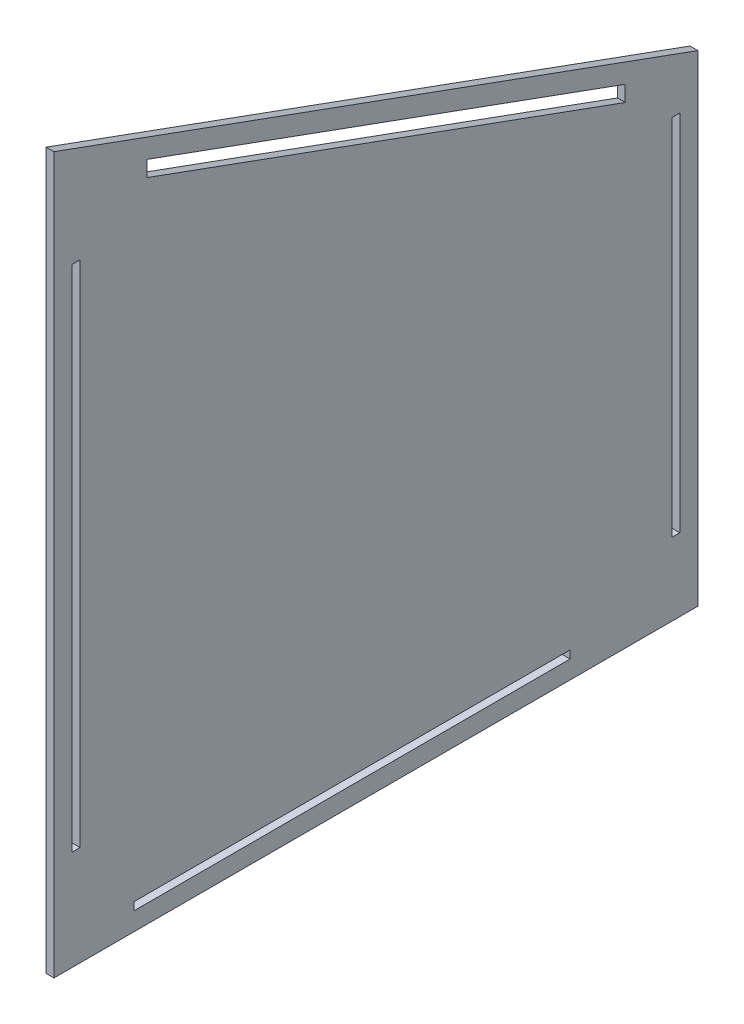
ISO-10303-21;
HEADER;
FILE_DESCRIPTION(('STEP AP214'),'2;1');
FILE_NAME('part.step','',(''),(''),'','','');
FILE_SCHEMA(('AUTOMOTIVE_DESIGN { 1 0 10303 214 1 1 1 1 }'));
ENDSEC;
DATA;
#1=APPLICATION_CONTEXT('core data for automotive mechanical design processes');
#2=APPLICATION_PROTOCOL_DEFINITION('international standard','automotive_design',2000,#1);
#3=PRODUCT_CONTEXT('',#1,'mechanical');
#4=PRODUCT('Part','Part','',(#3));
#5=PRODUCT_RELATED_PRODUCT_CATEGORY('part','',(#4));
#6=PRODUCT_DEFINITION_FORMATION('','',#4);
#7=PRODUCT_DEFINITION_CONTEXT('part definition',#1,'design');
#8=PRODUCT_DEFINITION('design','',#6,#7);
#9=PRODUCT_DEFINITION_SHAPE('','',#8);
#10=(LENGTH_UNIT() NAMED_UNIT(*) SI_UNIT(.MILLI.,.METRE.));
#11=(NAMED_UNIT(*) PLANE_ANGLE_UNIT() SI_UNIT($,.RADIAN.));
#12=(NAMED_UNIT(*) SI_UNIT($,.STERADIAN.) SOLID_ANGLE_UNIT());
#13=UNCERTAINTY_MEASURE_WITH_UNIT(LENGTH_MEASURE(1.E-05),#10,'distance_accuracy_value','');
#14=(GEOMETRIC_REPRESENTATION_CONTEXT(3) GLOBAL_UNCERTAINTY_ASSIGNED_CONTEXT((#13)) GLOBAL_UNIT_ASSIGNED_CONTEXT((#10,
#11,#12)) REPRESENTATION_CONTEXT('',''));
#15=CARTESIAN_POINT('',(0.,0.,0.));
#16=DIRECTION('',(0.,0.,1.));
#17=DIRECTION('',(1.,0.,0.));
#18=AXIS2_PLACEMENT_3D('',#15,#16,#17);
#19=CARTESIAN_POINT('',(2.75,0.,0.));
#20=DIRECTION('',(-1.,0.,0.));
#21=DIRECTION('',(0.,0.,1.));
#22=AXIS2_PLACEMENT_3D('',#19,#20,#21);
#23=PLANE('',#22);
#24=DIRECTION('',(0.,-1.,0.));
#25=VECTOR('',#24,1.);
#26=CARTESIAN_POINT('',(2.75,425.45,-12.6999999999999));
#27=LINE('',#26,#25);
#28=CARTESIAN_POINT('',(2.75,425.45,-12.6999999999999));
#29=VERTEX_POINT('',#28);
#30=CARTESIAN_POINT('',(2.75,69.8499999999998,-12.6999999999999));
#31=VERTEX_POINT('',#30);
#32=EDGE_CURVE('E225',#29,#31,#27,.T.);
#33=ORIENTED_EDGE('',*,*,#32,.F.);
#34=DIRECTION('',(0.,0.,1.));
#35=VECTOR('',#34,1.);
#36=CARTESIAN_POINT('',(2.75,425.45,-12.6999999999999));
#37=LINE('',#36,#35);
#38=CARTESIAN_POINT('',(2.75,425.45,-18.1999999999999));
#39=VERTEX_POINT('',#38);
#40=EDGE_CURVE('E236',#39,#29,#37,.T.);
#41=ORIENTED_EDGE('',*,*,#40,.F.);
#42=DIRECTION('',(0.,1.,0.));
#43=VECTOR('',#42,1.);
#44=CARTESIAN_POINT('',(2.75,425.45,-18.1999999999999));
#45=LINE('',#44,#43);
#46=CARTESIAN_POINT('',(2.75,69.8499999999998,-18.1999999999999));
#47=VERTEX_POINT('',#46);
#48=EDGE_CURVE('E232',#47,#39,#45,.T.);
#49=ORIENTED_EDGE('',*,*,#48,.F.);
#50=DIRECTION('',(0.,0.,-1.));
#51=VECTOR('',#50,1.);
#52=CARTESIAN_POINT('',(2.75,69.8499999999998,-12.6999999999999));
#53=LINE('',#52,#51);
#54=EDGE_CURVE('E228',#31,#47,#53,.T.);
#55=ORIENTED_EDGE('',*,*,#54,.F.);
#56=EDGE_LOOP('',(#33,#41,#49,#55));
#57=FACE_BOUND('',#56,.T.);
#58=DIRECTION('',(0.,-1.,0.));
#59=VECTOR('',#58,1.);
#60=CARTESIAN_POINT('',(2.75,12.6999999999998,-55.88));
#61=LINE('',#60,#59);
#62=CARTESIAN_POINT('',(2.75,18.1999999999998,-55.88));
#63=VERTEX_POINT('',#62);
#64=CARTESIAN_POINT('',(2.75,12.6999999999998,-55.88));
#65=VERTEX_POINT('',#64);
#66=EDGE_CURVE('E311',#63,#65,#61,.T.);
#67=ORIENTED_EDGE('',*,*,#66,.F.);
#68=DIRECTION('',(0.,0.,1.));
#69=VECTOR('',#68,1.);
#70=CARTESIAN_POINT('',(2.75,18.1999999999998,-55.88));
#71=LINE('',#70,#69);
#72=CARTESIAN_POINT('',(2.75,18.1999999999998,-360.68));
#73=VERTEX_POINT('',#72);
#74=EDGE_CURVE('E322',#73,#63,#71,.T.);
#75=ORIENTED_EDGE('',*,*,#74,.F.);
#76=DIRECTION('',(0.,1.,0.));
#77=VECTOR('',#76,1.);
#78=CARTESIAN_POINT('',(2.75,12.6999999999998,-360.68));
#79=LINE('',#78,#77);
#80=CARTESIAN_POINT('',(2.75,12.6999999999998,-360.68));
#81=VERTEX_POINT('',#80);
#82=EDGE_CURVE('E318',#81,#73,#79,.T.);
#83=ORIENTED_EDGE('',*,*,#82,.F.);
#84=DIRECTION('',(0.,0.,-1.));
#85=VECTOR('',#84,1.);
#86=CARTESIAN_POINT('',(2.75,12.6999999999998,-55.88));
#87=LINE('',#86,#85);
#88=EDGE_CURVE('E314',#65,#81,#87,.T.);
#89=ORIENTED_EDGE('',*,*,#88,.F.);
#90=EDGE_LOOP('',(#67,#75,#83,#89));
#91=FACE_BOUND('',#90,.T.);
#92=DIRECTION('',(0.,1.,0.));
#93=VECTOR('',#92,1.);
#94=CARTESIAN_POINT('',(2.75,336.213394580207,-450.));
#95=LINE('',#94,#93);
#96=CARTESIAN_POINT('',(2.75,0.,-450.));
#97=VERTEX_POINT('',#96);
#98=CARTESIAN_POINT('',(2.75,336.213394580207,-450.));
#99=VERTEX_POINT('',#98);
#100=EDGE_CURVE('E354',#97,#99,#95,.T.);
#101=ORIENTED_EDGE('',*,*,#100,.T.);
#102=DIRECTION('',(0.,0.342020143325672,0.939692620785907));
#103=VECTOR('',#102,1.);
#104=CARTESIAN_POINT('',(2.75,500.,1.22514845490862E-13));
#105=LINE('',#104,#103);
#106=CARTESIAN_POINT('',(2.75,500.,1.22514845490862E-13));
#107=VERTEX_POINT('',#106);
#108=EDGE_CURVE('E358',#99,#107,#105,.T.);
#109=ORIENTED_EDGE('',*,*,#108,.T.);
#110=DIRECTION('',(0.,-1.,0.));
#111=VECTOR('',#110,1.);
#112=CARTESIAN_POINT('',(2.75,0.,0.));
#113=LINE('',#112,#111);
#114=CARTESIAN_POINT('',(2.75,0.,0.));
#115=VERTEX_POINT('',#114);
#116=EDGE_CURVE('E362',#107,#115,#113,.T.);
#117=ORIENTED_EDGE('',*,*,#116,.T.);
#118=DIRECTION('',(0.,0.,-1.));
#119=VECTOR('',#118,1.);
#120=CARTESIAN_POINT('',(2.75,0.,-450.));
#121=LINE('',#120,#119);
#122=EDGE_CURVE('E365',#115,#97,#121,.T.);
#123=ORIENTED_EDGE('',*,*,#122,.T.);
#124=EDGE_LOOP('',(#101,#109,#117,#123));
#125=FACE_BOUND('',#124,.T.);
#126=DIRECTION('',(0.,-1.,0.));
#127=VECTOR('',#126,1.);
#128=CARTESIAN_POINT('',(2.75,462.810387737095,-65.0453040485314));
#129=LINE('',#128,#127);
#130=CARTESIAN_POINT('',(2.75,462.810387737095,-65.0453040485314));
#131=VERTEX_POINT('',#130);
#132=CARTESIAN_POINT('',(2.75,451.810387737095,-65.0453040485314));
#133=VERTEX_POINT('',#132);
#134=EDGE_CURVE('E268',#131,#133,#129,.T.);
#135=ORIENTED_EDGE('',*,*,#134,.F.);
#136=DIRECTION('',(0.,0.342020143325672,0.939692620785907));
#137=VECTOR('',#136,1.);
#138=CARTESIAN_POINT('',(2.75,462.810387737095,-65.0453040485314));
#139=LINE('',#138,#137);
#140=CARTESIAN_POINT('',(2.75,341.188024770486,-399.2));
#141=VERTEX_POINT('',#140);
#142=EDGE_CURVE('E279',#141,#131,#139,.T.);
#143=ORIENTED_EDGE('',*,*,#142,.F.);
#144=DIRECTION('',(0.,1.,0.));
#145=VECTOR('',#144,1.);
#146=CARTESIAN_POINT('',(2.75,341.188024770486,-399.2));
#147=LINE('',#146,#145);
#148=CARTESIAN_POINT('',(2.75,330.188024770486,-399.2));
#149=VERTEX_POINT('',#148);
#150=EDGE_CURVE('E275',#149,#141,#147,.T.);
#151=ORIENTED_EDGE('',*,*,#150,.F.);
#152=DIRECTION('',(0.,-0.342020143325672,-0.939692620785907));
#153=VECTOR('',#152,1.);
#154=CARTESIAN_POINT('',(2.75,451.810387737095,-65.0453040485314));
#155=LINE('',#154,#153);
#156=EDGE_CURVE('E271',#133,#149,#155,.T.);
#157=ORIENTED_EDGE('',*,*,#156,.F.);
#158=EDGE_LOOP('',(#135,#143,#151,#157));
#159=FACE_BOUND('',#158,.T.);
#160=DIRECTION('',(0.,-1.,0.));
#161=VECTOR('',#160,1.);
#162=CARTESIAN_POINT('',(2.75,304.8,-431.8));
#163=LINE('',#162,#161);
#164=CARTESIAN_POINT('',(2.75,304.8,-431.8));
#165=VERTEX_POINT('',#164);
#166=CARTESIAN_POINT('',(2.75,50.8,-431.8));
#167=VERTEX_POINT('',#166);
#168=EDGE_CURVE('E177',#165,#167,#163,.T.);
#169=ORIENTED_EDGE('',*,*,#168,.F.);
#170=DIRECTION('',(0.,0.,1.));
#171=VECTOR('',#170,1.);
#172=CARTESIAN_POINT('',(2.75,304.8,-431.8));
#173=LINE('',#172,#171);
#174=CARTESIAN_POINT('',(2.75,304.8,-437.3));
#175=VERTEX_POINT('',#174);
#176=EDGE_CURVE('E203',#175,#165,#173,.T.);
#177=ORIENTED_EDGE('',*,*,#176,.F.);
#178=DIRECTION('',(0.,1.,0.));
#179=VECTOR('',#178,1.);
#180=CARTESIAN_POINT('',(2.75,304.8,-437.3));
#181=LINE('',#180,#179);
#182=CARTESIAN_POINT('',(2.75,50.8,-437.3));
#183=VERTEX_POINT('',#182);
#184=EDGE_CURVE('E199',#183,#175,#181,.T.);
#185=ORIENTED_EDGE('',*,*,#184,.F.);
#186=DIRECTION('',(0.,0.,-1.));
#187=VECTOR('',#186,1.);
#188=CARTESIAN_POINT('',(2.75,50.8,-431.8));
#189=LINE('',#188,#187);
#190=EDGE_CURVE('E186',#167,#183,#189,.T.);
#191=ORIENTED_EDGE('',*,*,#190,.F.);
#192=EDGE_LOOP('',(#169,#177,#185,#191));
#193=FACE_BOUND('',#192,.T.);
#194=ADVANCED_FACE('F39',(#57,#91,#125,#159,#193),#23,.F.);
#195=CARTESIAN_POINT('',(-2.75,0.,0.));
#196=DIRECTION('',(-1.,0.,0.));
#197=DIRECTION('',(0.,0.,1.));
#198=AXIS2_PLACEMENT_3D('',#195,#196,#197);
#199=PLANE('',#198);
#200=DIRECTION('',(0.,1.,0.));
#201=VECTOR('',#200,1.);
#202=CARTESIAN_POINT('',(-2.75,336.213394580207,-450.));
#203=LINE('',#202,#201);
#204=CARTESIAN_POINT('',(-2.75,0.,-450.));
#205=VERTEX_POINT('',#204);
#206=CARTESIAN_POINT('',(-2.75,336.213394580207,-450.));
#207=VERTEX_POINT('',#206);
#208=EDGE_CURVE('E353',#205,#207,#203,.T.);
#209=ORIENTED_EDGE('',*,*,#208,.F.);
#210=DIRECTION('',(0.,0.,-1.));
#211=VECTOR('',#210,1.);
#212=CARTESIAN_POINT('',(-2.75,0.,-450.));
#213=LINE('',#212,#211);
#214=CARTESIAN_POINT('',(-2.75,0.,0.));
#215=VERTEX_POINT('',#214);
#216=EDGE_CURVE('E359',#215,#205,#213,.T.);
#217=ORIENTED_EDGE('',*,*,#216,.F.);
#218=DIRECTION('',(0.,-1.,0.));
#219=VECTOR('',#218,1.);
#220=CARTESIAN_POINT('',(-2.75,0.,0.));
#221=LINE('',#220,#219);
#222=CARTESIAN_POINT('',(-2.75,500.,1.22514845490862E-13));
#223=VERTEX_POINT('',#222);
#224=EDGE_CURVE('E375',#223,#215,#221,.T.);
#225=ORIENTED_EDGE('',*,*,#224,.F.);
#226=DIRECTION('',(0.,0.342020143325672,0.939692620785907));
#227=VECTOR('',#226,1.);
#228=CARTESIAN_POINT('',(-2.75,500.,1.22514845490862E-13));
#229=LINE('',#228,#227);
#230=EDGE_CURVE('E372',#207,#223,#229,.T.);
#231=ORIENTED_EDGE('',*,*,#230,.F.);
#232=EDGE_LOOP('',(#209,#217,#225,#231));
#233=FACE_BOUND('',#232,.T.);
#234=DIRECTION('',(0.,0.,1.));
#235=VECTOR('',#234,1.);
#236=CARTESIAN_POINT('',(-2.75,18.1999999999998,-55.88));
#237=LINE('',#236,#235);
#238=CARTESIAN_POINT('',(-2.75,18.1999999999998,-360.68));
#239=VERTEX_POINT('',#238);
#240=CARTESIAN_POINT('',(-2.75,18.1999999999998,-55.88));
#241=VERTEX_POINT('',#240);
#242=EDGE_CURVE('E315',#239,#241,#237,.T.);
#243=ORIENTED_EDGE('',*,*,#242,.T.);
#244=DIRECTION('',(0.,-1.,0.));
#245=VECTOR('',#244,1.);
#246=CARTESIAN_POINT('',(-2.75,12.6999999999998,-55.88));
#247=LINE('',#246,#245);
#248=CARTESIAN_POINT('',(-2.75,12.6999999999998,-55.88));
#249=VERTEX_POINT('',#248);
#250=EDGE_CURVE('E310',#241,#249,#247,.T.);
#251=ORIENTED_EDGE('',*,*,#250,.T.);
#252=DIRECTION('',(0.,0.,-1.));
#253=VECTOR('',#252,1.);
#254=CARTESIAN_POINT('',(-2.75,12.6999999999998,-55.88));
#255=LINE('',#254,#253);
#256=CARTESIAN_POINT('',(-2.75,12.6999999999998,-360.68));
#257=VERTEX_POINT('',#256);
#258=EDGE_CURVE('E329',#249,#257,#255,.T.);
#259=ORIENTED_EDGE('',*,*,#258,.T.);
#260=DIRECTION('',(0.,1.,0.));
#261=VECTOR('',#260,1.);
#262=CARTESIAN_POINT('',(-2.75,12.6999999999998,-360.68));
#263=LINE('',#262,#261);
#264=EDGE_CURVE('E333',#257,#239,#263,.T.);
#265=ORIENTED_EDGE('',*,*,#264,.T.);
#266=EDGE_LOOP('',(#243,#251,#259,#265));
#267=FACE_BOUND('',#266,.T.);
#268=DIRECTION('',(0.,0.342020143325672,0.939692620785907));
#269=VECTOR('',#268,1.);
#270=CARTESIAN_POINT('',(-2.75,462.810387737095,-65.0453040485314));
#271=LINE('',#270,#269);
#272=CARTESIAN_POINT('',(-2.75,341.188024770486,-399.2));
#273=VERTEX_POINT('',#272);
#274=CARTESIAN_POINT('',(-2.75,462.810387737095,-65.0453040485314));
#275=VERTEX_POINT('',#274);
#276=EDGE_CURVE('E272',#273,#275,#271,.T.);
#277=ORIENTED_EDGE('',*,*,#276,.T.);
#278=DIRECTION('',(0.,-1.,0.));
#279=VECTOR('',#278,1.);
#280=CARTESIAN_POINT('',(-2.75,462.810387737095,-65.0453040485314));
#281=LINE('',#280,#279);
#282=CARTESIAN_POINT('',(-2.75,451.810387737095,-65.0453040485314));
#283=VERTEX_POINT('',#282);
#284=EDGE_CURVE('E267',#275,#283,#281,.T.);
#285=ORIENTED_EDGE('',*,*,#284,.T.);
#286=DIRECTION('',(0.,-0.342020143325672,-0.939692620785907));
#287=VECTOR('',#286,1.);
#288=CARTESIAN_POINT('',(-2.75,451.810387737095,-65.0453040485314));
#289=LINE('',#288,#287);
#290=CARTESIAN_POINT('',(-2.75,330.188024770486,-399.2));
#291=VERTEX_POINT('',#290);
#292=EDGE_CURVE('E286',#283,#291,#289,.T.);
#293=ORIENTED_EDGE('',*,*,#292,.T.);
#294=DIRECTION('',(0.,1.,0.));
#295=VECTOR('',#294,1.);
#296=CARTESIAN_POINT('',(-2.75,341.188024770486,-399.2));
#297=LINE('',#296,#295);
#298=EDGE_CURVE('E290',#291,#273,#297,.T.);
#299=ORIENTED_EDGE('',*,*,#298,.T.);
#300=EDGE_LOOP('',(#277,#285,#293,#299));
#301=FACE_BOUND('',#300,.T.);
#302=DIRECTION('',(0.,0.,1.));
#303=VECTOR('',#302,1.);
#304=CARTESIAN_POINT('',(-2.75,425.45,-12.6999999999999));
#305=LINE('',#304,#303);
#306=CARTESIAN_POINT('',(-2.75,425.45,-18.1999999999999));
#307=VERTEX_POINT('',#306);
#308=CARTESIAN_POINT('',(-2.75,425.45,-12.6999999999999));
#309=VERTEX_POINT('',#308);
#310=EDGE_CURVE('E229',#307,#309,#305,.T.);
#311=ORIENTED_EDGE('',*,*,#310,.T.);
#312=DIRECTION('',(0.,-1.,0.));
#313=VECTOR('',#312,1.);
#314=CARTESIAN_POINT('',(-2.75,425.45,-12.6999999999999));
#315=LINE('',#314,#313);
#316=CARTESIAN_POINT('',(-2.75,69.8499999999998,-12.6999999999999));
#317=VERTEX_POINT('',#316);
#318=EDGE_CURVE('E195',#309,#317,#315,.T.);
#319=ORIENTED_EDGE('',*,*,#318,.T.);
#320=DIRECTION('',(0.,0.,-1.));
#321=VECTOR('',#320,1.);
#322=CARTESIAN_POINT('',(-2.75,69.8499999999998,-12.6999999999999));
#323=LINE('',#322,#321);
#324=CARTESIAN_POINT('',(-2.75,69.8499999999998,-18.1999999999999));
#325=VERTEX_POINT('',#324);
#326=EDGE_CURVE('E243',#317,#325,#323,.T.);
#327=ORIENTED_EDGE('',*,*,#326,.T.);
#328=DIRECTION('',(0.,1.,0.));
#329=VECTOR('',#328,1.);
#330=CARTESIAN_POINT('',(-2.75,425.45,-18.1999999999999));
#331=LINE('',#330,#329);
#332=EDGE_CURVE('E247',#325,#307,#331,.T.);
#333=ORIENTED_EDGE('',*,*,#332,.T.);
#334=EDGE_LOOP('',(#311,#319,#327,#333));
#335=FACE_BOUND('',#334,.T.);
#336=DIRECTION('',(0.,0.,1.));
#337=VECTOR('',#336,1.);
#338=CARTESIAN_POINT('',(-2.75,304.8,-431.8));
#339=LINE('',#338,#337);
#340=CARTESIAN_POINT('',(-2.75,304.8,-437.3));
#341=VERTEX_POINT('',#340);
#342=CARTESIAN_POINT('',(-2.75,304.8,-431.8));
#343=VERTEX_POINT('',#342);
#344=EDGE_CURVE('E187',#341,#343,#339,.T.);
#345=ORIENTED_EDGE('',*,*,#344,.T.);
#346=DIRECTION('',(0.,-1.,0.));
#347=VECTOR('',#346,1.);
#348=CARTESIAN_POINT('',(-2.75,304.8,-431.8));
#349=LINE('',#348,#347);
#350=CARTESIAN_POINT('',(-2.75,50.8,-431.8));
#351=VERTEX_POINT('',#350);
#352=EDGE_CURVE('E63',#343,#351,#349,.T.);
#353=ORIENTED_EDGE('',*,*,#352,.T.);
#354=DIRECTION('',(0.,0.,-1.));
#355=VECTOR('',#354,1.);
#356=CARTESIAN_POINT('',(-2.75,50.8,-431.8));
#357=LINE('',#356,#355);
#358=CARTESIAN_POINT('',(-2.75,50.8,-437.3));
#359=VERTEX_POINT('',#358);
#360=EDGE_CURVE('E193',#351,#359,#357,.T.);
#361=ORIENTED_EDGE('',*,*,#360,.T.);
#362=DIRECTION('',(0.,1.,0.));
#363=VECTOR('',#362,1.);
#364=CARTESIAN_POINT('',(-2.75,304.8,-437.3));
#365=LINE('',#364,#363);
#366=EDGE_CURVE('E212',#359,#341,#365,.T.);
#367=ORIENTED_EDGE('',*,*,#366,.T.);
#368=EDGE_LOOP('',(#345,#353,#361,#367));
#369=FACE_BOUND('',#368,.T.);
#370=ADVANCED_FACE('F398',(#233,#267,#301,#335,#369),#199,.T.);
#371=CARTESIAN_POINT('',(2.75,336.213394580207,-450.));
#372=DIRECTION('',(0.,0.,1.));
#373=DIRECTION('',(0.,-1.,0.));
#374=AXIS2_PLACEMENT_3D('',#371,#372,#373);
#375=PLANE('',#374);
#376=ORIENTED_EDGE('',*,*,#208,.T.);
#377=DIRECTION('',(-1.,0.,0.));
#378=VECTOR('',#377,1.);
#379=CARTESIAN_POINT('',(2.75,336.213394580207,-450.));
#380=LINE('',#379,#378);
#381=EDGE_CURVE('E11',#99,#207,#380,.T.);
#382=ORIENTED_EDGE('',*,*,#381,.F.);
#383=ORIENTED_EDGE('',*,*,#100,.F.);
#384=DIRECTION('',(-1.,0.,0.));
#385=VECTOR('',#384,1.);
#386=CARTESIAN_POINT('',(2.75,0.,-450.));
#387=LINE('',#386,#385);
#388=EDGE_CURVE('E368',#97,#205,#387,.T.);
#389=ORIENTED_EDGE('',*,*,#388,.T.);
#390=EDGE_LOOP('',(#376,#382,#383,#389));
#391=FACE_BOUND('',#390,.T.);
#392=ADVANCED_FACE('F41',(#391),#375,.F.);
#393=CARTESIAN_POINT('',(2.75,500.,1.22514845490862E-13));
#394=DIRECTION('',(0.,-0.939692620785907,0.342020143325672));
#395=DIRECTION('',(0.,-0.342020143325672,-0.939692620785907));
#396=AXIS2_PLACEMENT_3D('',#393,#394,#395);
#397=PLANE('',#396);
#398=ORIENTED_EDGE('',*,*,#230,.T.);
#399=DIRECTION('',(-1.,0.,0.));
#400=VECTOR('',#399,1.);
#401=CARTESIAN_POINT('',(2.75,500.,1.22514845490862E-13));
#402=LINE('',#401,#400);
#403=EDGE_CURVE('E48',#107,#223,#402,.T.);
#404=ORIENTED_EDGE('',*,*,#403,.F.);
#405=ORIENTED_EDGE('',*,*,#108,.F.);
#406=ORIENTED_EDGE('',*,*,#381,.T.);
#407=EDGE_LOOP('',(#398,#404,#405,#406));
#408=FACE_BOUND('',#407,.T.);
#409=ADVANCED_FACE('F409',(#408),#397,.F.);
#410=CARTESIAN_POINT('',(2.75,0.,0.));
#411=DIRECTION('',(0.,0.,-1.));
#412=DIRECTION('',(0.,1.,0.));
#413=AXIS2_PLACEMENT_3D('',#410,#411,#412);
#414=PLANE('',#413);
#415=ORIENTED_EDGE('',*,*,#224,.T.);
#416=DIRECTION('',(-1.,0.,0.));
#417=VECTOR('',#416,1.);
#418=CARTESIAN_POINT('',(2.75,0.,0.));
#419=LINE('',#418,#417);
#420=EDGE_CURVE('E383',#115,#215,#419,.T.);
#421=ORIENTED_EDGE('',*,*,#420,.F.);
#422=ORIENTED_EDGE('',*,*,#116,.F.);
#423=ORIENTED_EDGE('',*,*,#403,.T.);
#424=EDGE_LOOP('',(#415,#421,#422,#423));
#425=FACE_BOUND('',#424,.T.);
#426=ADVANCED_FACE('F392',(#425),#414,.F.);
#427=CARTESIAN_POINT('',(2.75,0.,-450.));
#428=DIRECTION('',(0.,1.,0.));
#429=DIRECTION('',(0.,0.,1.));
#430=AXIS2_PLACEMENT_3D('',#427,#428,#429);
#431=PLANE('',#430);
#432=ORIENTED_EDGE('',*,*,#216,.T.);
#433=ORIENTED_EDGE('',*,*,#388,.F.);
#434=ORIENTED_EDGE('',*,*,#122,.F.);
#435=ORIENTED_EDGE('',*,*,#420,.T.);
#436=EDGE_LOOP('',(#432,#433,#434,#435));
#437=FACE_BOUND('',#436,.T.);
#438=ADVANCED_FACE('F402',(#437),#431,.F.);
#439=CARTESIAN_POINT('',(2.75,12.6999999999998,-55.88));
#440=DIRECTION('',(0.,0.,-1.));
#441=DIRECTION('',(-1.,0.,0.));
#442=AXIS2_PLACEMENT_3D('',#439,#440,#441);
#443=PLANE('',#442);
#444=ORIENTED_EDGE('',*,*,#250,.F.);
#445=DIRECTION('',(-1.,0.,0.));
#446=VECTOR('',#445,1.);
#447=CARTESIAN_POINT('',(2.75,18.1999999999998,-55.88));
#448=LINE('',#447,#446);
#449=EDGE_CURVE('E325',#63,#241,#448,.T.);
#450=ORIENTED_EDGE('',*,*,#449,.F.);
#451=ORIENTED_EDGE('',*,*,#66,.T.);
#452=DIRECTION('',(-1.,0.,0.));
#453=VECTOR('',#452,1.);
#454=CARTESIAN_POINT('',(2.75,12.6999999999998,-55.88));
#455=LINE('',#454,#453);
#456=EDGE_CURVE('E349',#65,#249,#455,.T.);
#457=ORIENTED_EDGE('',*,*,#456,.T.);
#458=EDGE_LOOP('',(#444,#450,#451,#457));
#459=FACE_BOUND('',#458,.T.);
#460=ADVANCED_FACE('F426',(#459),#443,.T.);
#461=CARTESIAN_POINT('',(2.75,12.6999999999998,-55.88));
#462=DIRECTION('',(0.,1.,0.));
#463=DIRECTION('',(0.,0.,1.));
#464=AXIS2_PLACEMENT_3D('',#461,#462,#463);
#465=PLANE('',#464);
#466=ORIENTED_EDGE('',*,*,#258,.F.);
#467=ORIENTED_EDGE('',*,*,#456,.F.);
#468=ORIENTED_EDGE('',*,*,#88,.T.);
#469=DIRECTION('',(-1.,0.,0.));
#470=VECTOR('',#469,1.);
#471=CARTESIAN_POINT('',(2.75,12.6999999999998,-360.68));
#472=LINE('',#471,#470);
#473=EDGE_CURVE('E346',#81,#257,#472,.T.);
#474=ORIENTED_EDGE('',*,*,#473,.T.);
#475=EDGE_LOOP('',(#466,#467,#468,#474));
#476=FACE_BOUND('',#475,.T.);
#477=ADVANCED_FACE('F433',(#476),#465,.T.);
#478=CARTESIAN_POINT('',(2.75,12.6999999999998,-360.68));
#479=DIRECTION('',(0.,0.,1.));
#480=DIRECTION('',(1.,0.,0.));
#481=AXIS2_PLACEMENT_3D('',#478,#479,#480);
#482=PLANE('',#481);
#483=ORIENTED_EDGE('',*,*,#264,.F.);
#484=ORIENTED_EDGE('',*,*,#473,.F.);
#485=ORIENTED_EDGE('',*,*,#82,.T.);
#486=DIRECTION('',(-1.,0.,0.));
#487=VECTOR('',#486,1.);
#488=CARTESIAN_POINT('',(2.75,18.1999999999998,-360.68));
#489=LINE('',#488,#487);
#490=EDGE_CURVE('E343',#73,#239,#489,.T.);
#491=ORIENTED_EDGE('',*,*,#490,.T.);
#492=EDGE_LOOP('',(#483,#484,#485,#491));
#493=FACE_BOUND('',#492,.T.);
#494=ADVANCED_FACE('F438',(#493),#482,.T.);
#495=CARTESIAN_POINT('',(2.75,18.1999999999998,-55.88));
#496=DIRECTION('',(0.,-1.,0.));
#497=DIRECTION('',(0.,0.,-1.));
#498=AXIS2_PLACEMENT_3D('',#495,#496,#497);
#499=PLANE('',#498);
#500=ORIENTED_EDGE('',*,*,#242,.F.);
#501=ORIENTED_EDGE('',*,*,#490,.F.);
#502=ORIENTED_EDGE('',*,*,#74,.T.);
#503=ORIENTED_EDGE('',*,*,#449,.T.);
#504=EDGE_LOOP('',(#500,#501,#502,#503));
#505=FACE_BOUND('',#504,.T.);
#506=ADVANCED_FACE('F445',(#505),#499,.T.);
#507=CARTESIAN_POINT('',(2.75,462.810387737095,-65.0453040485314));
#508=DIRECTION('',(0.,0.,-1.));
#509=DIRECTION('',(-1.,0.,0.));
#510=AXIS2_PLACEMENT_3D('',#507,#508,#509);
#511=PLANE('',#510);
#512=ORIENTED_EDGE('',*,*,#284,.F.);
#513=DIRECTION('',(-1.,0.,0.));
#514=VECTOR('',#513,1.);
#515=CARTESIAN_POINT('',(2.75,462.810387737095,-65.0453040485314));
#516=LINE('',#515,#514);
#517=EDGE_CURVE('E282',#131,#275,#516,.T.);
#518=ORIENTED_EDGE('',*,*,#517,.F.);
#519=ORIENTED_EDGE('',*,*,#134,.T.);
#520=DIRECTION('',(-1.,0.,0.));
#521=VECTOR('',#520,1.);
#522=CARTESIAN_POINT('',(2.75,451.810387737095,-65.0453040485314));
#523=LINE('',#522,#521);
#524=EDGE_CURVE('E306',#133,#283,#523,.T.);
#525=ORIENTED_EDGE('',*,*,#524,.T.);
#526=EDGE_LOOP('',(#512,#518,#519,#525));
#527=FACE_BOUND('',#526,.T.);
#528=ADVANCED_FACE('F458',(#527),#511,.T.);
#529=CARTESIAN_POINT('',(2.75,451.810387737095,-65.0453040485314));
#530=DIRECTION('',(0.,0.939692620785907,-0.342020143325672));
#531=DIRECTION('',(0.,0.342020143325672,0.939692620785907));
#532=AXIS2_PLACEMENT_3D('',#529,#530,#531);
#533=PLANE('',#532);
#534=ORIENTED_EDGE('',*,*,#292,.F.);
#535=ORIENTED_EDGE('',*,*,#524,.F.);
#536=ORIENTED_EDGE('',*,*,#156,.T.);
#537=DIRECTION('',(-1.,0.,0.));
#538=VECTOR('',#537,1.);
#539=CARTESIAN_POINT('',(2.75,330.188024770486,-399.2));
#540=LINE('',#539,#538);
#541=EDGE_CURVE('E303',#149,#291,#540,.T.);
#542=ORIENTED_EDGE('',*,*,#541,.T.);
#543=EDGE_LOOP('',(#534,#535,#536,#542));
#544=FACE_BOUND('',#543,.T.);
#545=ADVANCED_FACE('F463',(#544),#533,.T.);
#546=CARTESIAN_POINT('',(2.75,341.188024770486,-399.2));
#547=DIRECTION('',(0.,0.,1.));
#548=DIRECTION('',(0.,-1.,0.));
#549=AXIS2_PLACEMENT_3D('',#546,#547,#548);
#550=PLANE('',#549);
#551=ORIENTED_EDGE('',*,*,#298,.F.);
#552=ORIENTED_EDGE('',*,*,#541,.F.);
#553=ORIENTED_EDGE('',*,*,#150,.T.);
#554=DIRECTION('',(-1.,0.,0.));
#555=VECTOR('',#554,1.);
#556=CARTESIAN_POINT('',(2.75,341.188024770486,-399.2));
#557=LINE('',#556,#555);
#558=EDGE_CURVE('E300',#141,#273,#557,.T.);
#559=ORIENTED_EDGE('',*,*,#558,.T.);
#560=EDGE_LOOP('',(#551,#552,#553,#559));
#561=FACE_BOUND('',#560,.T.);
#562=ADVANCED_FACE('F467',(#561),#550,.T.);
#563=CARTESIAN_POINT('',(2.75,462.810387737095,-65.0453040485314));
#564=DIRECTION('',(0.,-0.939692620785907,0.342020143325672));
#565=DIRECTION('',(0.,-0.342020143325672,-0.939692620785907));
#566=AXIS2_PLACEMENT_3D('',#563,#564,#565);
#567=PLANE('',#566);
#568=ORIENTED_EDGE('',*,*,#276,.F.);
#569=ORIENTED_EDGE('',*,*,#558,.F.);
#570=ORIENTED_EDGE('',*,*,#142,.T.);
#571=ORIENTED_EDGE('',*,*,#517,.T.);
#572=EDGE_LOOP('',(#568,#569,#570,#571));
#573=FACE_BOUND('',#572,.T.);
#574=ADVANCED_FACE('F471',(#573),#567,.T.);
#575=CARTESIAN_POINT('',(2.75,425.45,-12.6999999999999));
#576=DIRECTION('',(0.,0.,-1.));
#577=DIRECTION('',(0.,1.,0.));
#578=AXIS2_PLACEMENT_3D('',#575,#576,#577);
#579=PLANE('',#578);
#580=ORIENTED_EDGE('',*,*,#318,.F.);
#581=DIRECTION('',(-1.,0.,0.));
#582=VECTOR('',#581,1.);
#583=CARTESIAN_POINT('',(2.75,425.45,-12.6999999999999));
#584=LINE('',#583,#582);
#585=EDGE_CURVE('E239',#29,#309,#584,.T.);
#586=ORIENTED_EDGE('',*,*,#585,.F.);
#587=ORIENTED_EDGE('',*,*,#32,.T.);
#588=DIRECTION('',(-1.,0.,0.));
#589=VECTOR('',#588,1.);
#590=CARTESIAN_POINT('',(2.75,69.8499999999998,-12.6999999999999));
#591=LINE('',#590,#589);
#592=EDGE_CURVE('E263',#31,#317,#591,.T.);
#593=ORIENTED_EDGE('',*,*,#592,.T.);
#594=EDGE_LOOP('',(#580,#586,#587,#593));
#595=FACE_BOUND('',#594,.T.);
#596=ADVANCED_FACE('F475',(#595),#579,.T.);
#597=CARTESIAN_POINT('',(2.75,69.8499999999998,-12.6999999999999));
#598=DIRECTION('',(0.,1.,0.));
#599=DIRECTION('',(0.,0.,1.));
#600=AXIS2_PLACEMENT_3D('',#597,#598,#599);
#601=PLANE('',#600);
#602=ORIENTED_EDGE('',*,*,#326,.F.);
#603=ORIENTED_EDGE('',*,*,#592,.F.);
#604=ORIENTED_EDGE('',*,*,#54,.T.);
#605=DIRECTION('',(-1.,0.,0.));
#606=VECTOR('',#605,1.);
#607=CARTESIAN_POINT('',(2.75,69.8499999999998,-18.1999999999999));
#608=LINE('',#607,#606);
#609=EDGE_CURVE('E260',#47,#325,#608,.T.);
#610=ORIENTED_EDGE('',*,*,#609,.T.);
#611=EDGE_LOOP('',(#602,#603,#604,#610));
#612=FACE_BOUND('',#611,.T.);
#613=ADVANCED_FACE('F479',(#612),#601,.T.);
#614=CARTESIAN_POINT('',(2.75,425.45,-18.1999999999999));
#615=DIRECTION('',(0.,0.,1.));
#616=DIRECTION('',(0.,-1.,0.));
#617=AXIS2_PLACEMENT_3D('',#614,#615,#616);
#618=PLANE('',#617);
#619=ORIENTED_EDGE('',*,*,#332,.F.);
#620=ORIENTED_EDGE('',*,*,#609,.F.);
#621=ORIENTED_EDGE('',*,*,#48,.T.);
#622=DIRECTION('',(-1.,0.,0.));
#623=VECTOR('',#622,1.);
#624=CARTESIAN_POINT('',(2.75,425.45,-18.1999999999999));
#625=LINE('',#624,#623);
#626=EDGE_CURVE('E257',#39,#307,#625,.T.);
#627=ORIENTED_EDGE('',*,*,#626,.T.);
#628=EDGE_LOOP('',(#619,#620,#621,#627));
#629=FACE_BOUND('',#628,.T.);
#630=ADVANCED_FACE('F483',(#629),#618,.T.);
#631=CARTESIAN_POINT('',(2.75,425.45,-12.6999999999999));
#632=DIRECTION('',(0.,-1.,0.));
#633=DIRECTION('',(0.,0.,-1.));
#634=AXIS2_PLACEMENT_3D('',#631,#632,#633);
#635=PLANE('',#634);
#636=ORIENTED_EDGE('',*,*,#310,.F.);
#637=ORIENTED_EDGE('',*,*,#626,.F.);
#638=ORIENTED_EDGE('',*,*,#40,.T.);
#639=ORIENTED_EDGE('',*,*,#585,.T.);
#640=EDGE_LOOP('',(#636,#637,#638,#639));
#641=FACE_BOUND('',#640,.T.);
#642=ADVANCED_FACE('F487',(#641),#635,.T.);
#643=CARTESIAN_POINT('',(2.75,304.8,-431.8));
#644=DIRECTION('',(0.,0.,-1.));
#645=DIRECTION('',(0.,1.,0.));
#646=AXIS2_PLACEMENT_3D('',#643,#644,#645);
#647=PLANE('',#646);
#648=ORIENTED_EDGE('',*,*,#352,.F.);
#649=DIRECTION('',(-1.,0.,0.));
#650=VECTOR('',#649,1.);
#651=CARTESIAN_POINT('',(2.75,304.8,-431.8));
#652=LINE('',#651,#650);
#653=EDGE_CURVE('E181',#165,#343,#652,.T.);
#654=ORIENTED_EDGE('',*,*,#653,.F.);
#655=ORIENTED_EDGE('',*,*,#168,.T.);
#656=DIRECTION('',(-1.,0.,0.));
#657=VECTOR('',#656,1.);
#658=CARTESIAN_POINT('',(2.75,50.8,-431.8));
#659=LINE('',#658,#657);
#660=EDGE_CURVE('E180',#167,#351,#659,.T.);
#661=ORIENTED_EDGE('',*,*,#660,.T.);
#662=EDGE_LOOP('',(#648,#654,#655,#661));
#663=FACE_BOUND('',#662,.T.);
#664=ADVANCED_FACE('F179',(#663),#647,.T.);
#665=CARTESIAN_POINT('',(2.75,50.8,-431.8));
#666=DIRECTION('',(0.,1.,0.));
#667=DIRECTION('',(0.,0.,1.));
#668=AXIS2_PLACEMENT_3D('',#665,#666,#667);
#669=PLANE('',#668);
#670=ORIENTED_EDGE('',*,*,#360,.F.);
#671=ORIENTED_EDGE('',*,*,#660,.F.);
#672=ORIENTED_EDGE('',*,*,#190,.T.);
#673=DIRECTION('',(-1.,0.,0.));
#674=VECTOR('',#673,1.);
#675=CARTESIAN_POINT('',(2.75,50.8,-437.3));
#676=LINE('',#675,#674);
#677=EDGE_CURVE('E196',#183,#359,#676,.T.);
#678=ORIENTED_EDGE('',*,*,#677,.T.);
#679=EDGE_LOOP('',(#670,#671,#672,#678));
#680=FACE_BOUND('',#679,.T.);
#681=ADVANCED_FACE('F190',(#680),#669,.T.);
#682=CARTESIAN_POINT('',(2.75,304.8,-437.3));
#683=DIRECTION('',(0.,0.,1.));
#684=DIRECTION('',(0.,-1.,0.));
#685=AXIS2_PLACEMENT_3D('',#682,#683,#684);
#686=PLANE('',#685);
#687=ORIENTED_EDGE('',*,*,#366,.F.);
#688=ORIENTED_EDGE('',*,*,#677,.F.);
#689=ORIENTED_EDGE('',*,*,#184,.T.);
#690=DIRECTION('',(-1.,0.,0.));
#691=VECTOR('',#690,1.);
#692=CARTESIAN_POINT('',(2.75,304.8,-437.3));
#693=LINE('',#692,#691);
#694=EDGE_CURVE('E55',#175,#341,#693,.T.);
#695=ORIENTED_EDGE('',*,*,#694,.T.);
#696=EDGE_LOOP('',(#687,#688,#689,#695));
#697=FACE_BOUND('',#696,.T.);
#698=ADVANCED_FACE('F496',(#697),#686,.T.);
#699=CARTESIAN_POINT('',(2.75,304.8,-431.8));
#700=DIRECTION('',(0.,-1.,0.));
#701=DIRECTION('',(0.,0.,-1.));
#702=AXIS2_PLACEMENT_3D('',#699,#700,#701);
#703=PLANE('',#702);
#704=ORIENTED_EDGE('',*,*,#344,.F.);
#705=ORIENTED_EDGE('',*,*,#694,.F.);
#706=ORIENTED_EDGE('',*,*,#176,.T.);
#707=ORIENTED_EDGE('',*,*,#653,.T.);
#708=EDGE_LOOP('',(#704,#705,#706,#707));
#709=FACE_BOUND('',#708,.T.);
#710=ADVANCED_FACE('F499',(#709),#703,.T.);
#711=CLOSED_SHELL('',(#194,#370,#392,#409,#426,#438,#460,#477,#494,#506,#528,#545,#562,#574,
#596,#613,#630,#642,#664,#681,#698,#710));
#712=MANIFOLD_SOLID_BREP('B2',#711);
#713=ADVANCED_BREP_SHAPE_REPRESENTATION('',(#18,#712),#14);
#714=SHAPE_DEFINITION_REPRESENTATION(#9,#713);
ENDSEC;
END-ISO-10303-21;
